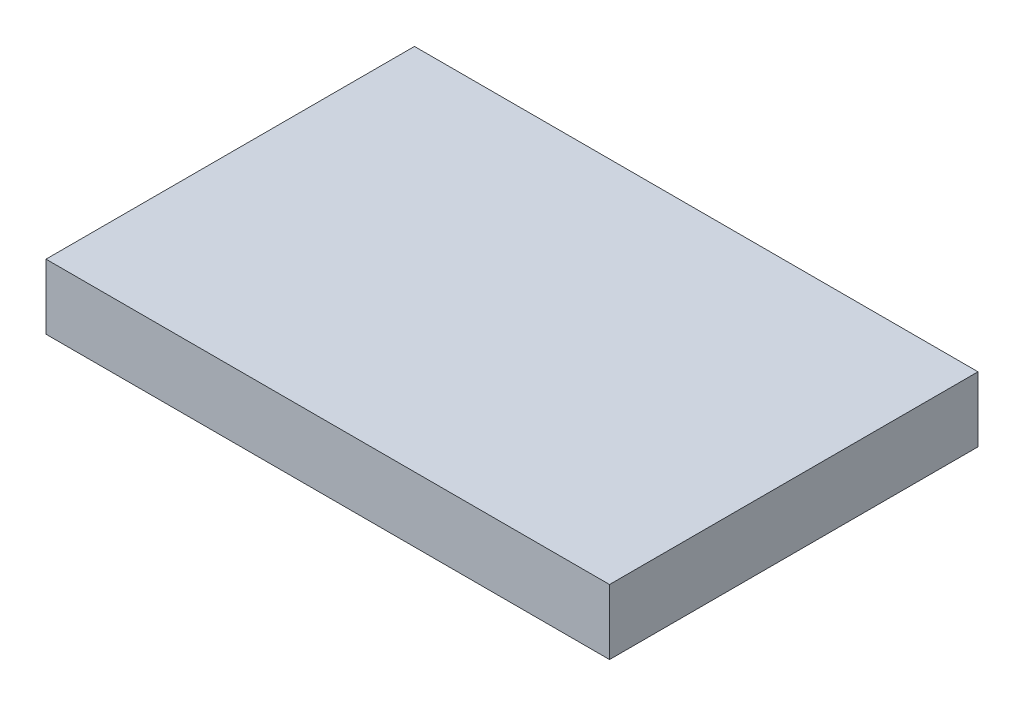
ISO-10303-21;
HEADER;
FILE_DESCRIPTION(('STEP AP214'),'2;1');
FILE_NAME('part.step','',(''),(''),'','','');
FILE_SCHEMA(('AUTOMOTIVE_DESIGN { 1 0 10303 214 1 1 1 1 }'));
ENDSEC;
DATA;
#1=APPLICATION_CONTEXT('core data for automotive mechanical design processes');
#2=APPLICATION_PROTOCOL_DEFINITION('international standard','automotive_design',2000,#1);
#3=PRODUCT_CONTEXT('',#1,'mechanical');
#4=PRODUCT('Part','Part','',(#3));
#5=PRODUCT_RELATED_PRODUCT_CATEGORY('part','',(#4));
#6=PRODUCT_DEFINITION_FORMATION('','',#4);
#7=PRODUCT_DEFINITION_CONTEXT('part definition',#1,'design');
#8=PRODUCT_DEFINITION('design','',#6,#7);
#9=PRODUCT_DEFINITION_SHAPE('','',#8);
#10=(LENGTH_UNIT() NAMED_UNIT(*) SI_UNIT(.MILLI.,.METRE.));
#11=(NAMED_UNIT(*) PLANE_ANGLE_UNIT() SI_UNIT($,.RADIAN.));
#12=(NAMED_UNIT(*) SI_UNIT($,.STERADIAN.) SOLID_ANGLE_UNIT());
#13=UNCERTAINTY_MEASURE_WITH_UNIT(LENGTH_MEASURE(1.E-05),#10,'distance_accuracy_value','');
#14=(GEOMETRIC_REPRESENTATION_CONTEXT(3) GLOBAL_UNCERTAINTY_ASSIGNED_CONTEXT((#13)) GLOBAL_UNIT_ASSIGNED_CONTEXT((#10,
#11,#12)) REPRESENTATION_CONTEXT('',''));
#15=CARTESIAN_POINT('',(0.,0.,0.));
#16=DIRECTION('',(0.,0.,1.));
#17=DIRECTION('',(1.,0.,0.));
#18=AXIS2_PLACEMENT_3D('',#15,#16,#17);
#19=CARTESIAN_POINT('',(-33.3639583333333,9.525,-21.8413541666667));
#20=DIRECTION('',(1.,0.,0.));
#21=DIRECTION('',(0.,0.,-1.));
#22=AXIS2_PLACEMENT_3D('',#19,#20,#21);
#23=PLANE('',#22);
#24=DIRECTION('',(0.,0.,1.));
#25=VECTOR('',#24,1.);
#26=CARTESIAN_POINT('',(-33.3639583333333,0.,-21.8413541666667));
#27=LINE('',#26,#25);
#28=CARTESIAN_POINT('',(-33.3639583333333,0.,-21.8413541666667));
#29=VERTEX_POINT('',#28);
#30=CARTESIAN_POINT('',(-33.3639583333333,0.,32.1336458333333));
#31=VERTEX_POINT('',#30);
#32=EDGE_CURVE('E96',#29,#31,#27,.T.);
#33=ORIENTED_EDGE('',*,*,#32,.T.);
#34=DIRECTION('',(0.,-1.,0.));
#35=VECTOR('',#34,1.);
#36=CARTESIAN_POINT('',(-33.3639583333333,9.525,32.1336458333333));
#37=LINE('',#36,#35);
#38=CARTESIAN_POINT('',(-33.3639583333333,9.525,32.1336458333333));
#39=VERTEX_POINT('',#38);
#40=EDGE_CURVE('E11',#39,#31,#37,.T.);
#41=ORIENTED_EDGE('',*,*,#40,.F.);
#42=DIRECTION('',(0.,0.,1.));
#43=VECTOR('',#42,1.);
#44=CARTESIAN_POINT('',(-33.3639583333333,9.525,-21.8413541666667));
#45=LINE('',#44,#43);
#46=CARTESIAN_POINT('',(-33.3639583333333,9.525,-21.8413541666667));
#47=VERTEX_POINT('',#46);
#48=EDGE_CURVE('E84',#47,#39,#45,.T.);
#49=ORIENTED_EDGE('',*,*,#48,.F.);
#50=DIRECTION('',(0.,-1.,0.));
#51=VECTOR('',#50,1.);
#52=CARTESIAN_POINT('',(-33.3639583333333,9.525,-21.8413541666667));
#53=LINE('',#52,#51);
#54=EDGE_CURVE('E92',#47,#29,#53,.T.);
#55=ORIENTED_EDGE('',*,*,#54,.T.);
#56=EDGE_LOOP('',(#33,#41,#49,#55));
#57=FACE_BOUND('',#56,.T.);
#58=ADVANCED_FACE('F33',(#57),#23,.F.);
#59=CARTESIAN_POINT('',(-33.3639583333333,9.525,32.1336458333333));
#60=DIRECTION('',(0.,0.,-1.));
#61=DIRECTION('',(-1.,0.,0.));
#62=AXIS2_PLACEMENT_3D('',#59,#60,#61);
#63=PLANE('',#62);
#64=DIRECTION('',(1.,0.,0.));
#65=VECTOR('',#64,1.);
#66=CARTESIAN_POINT('',(-33.3639583333333,0.,32.1336458333333));
#67=LINE('',#66,#65);
#68=CARTESIAN_POINT('',(49.1860416666667,0.,32.1336458333333));
#69=VERTEX_POINT('',#68);
#70=EDGE_CURVE('E88',#31,#69,#67,.T.);
#71=ORIENTED_EDGE('',*,*,#70,.T.);
#72=DIRECTION('',(0.,-1.,0.));
#73=VECTOR('',#72,1.);
#74=CARTESIAN_POINT('',(49.1860416666667,9.525,32.1336458333333));
#75=LINE('',#74,#73);
#76=CARTESIAN_POINT('',(49.1860416666667,9.525,32.1336458333333));
#77=VERTEX_POINT('',#76);
#78=EDGE_CURVE('E41',#77,#69,#75,.T.);
#79=ORIENTED_EDGE('',*,*,#78,.F.);
#80=DIRECTION('',(1.,0.,0.));
#81=VECTOR('',#80,1.);
#82=CARTESIAN_POINT('',(-33.3639583333333,9.525,32.1336458333333));
#83=LINE('',#82,#81);
#84=EDGE_CURVE('E79',#39,#77,#83,.T.);
#85=ORIENTED_EDGE('',*,*,#84,.F.);
#86=ORIENTED_EDGE('',*,*,#40,.T.);
#87=EDGE_LOOP('',(#71,#79,#85,#86));
#88=FACE_BOUND('',#87,.T.);
#89=ADVANCED_FACE('F87',(#88),#63,.F.);
#90=CARTESIAN_POINT('',(49.1860416666667,9.525,-21.8413541666667));
#91=DIRECTION('',(-1.,0.,0.));
#92=DIRECTION('',(0.,0.,1.));
#93=AXIS2_PLACEMENT_3D('',#90,#91,#92);
#94=PLANE('',#93);
#95=DIRECTION('',(0.,0.,-1.));
#96=VECTOR('',#95,1.);
#97=CARTESIAN_POINT('',(49.1860416666667,0.,-21.8413541666667));
#98=LINE('',#97,#96);
#99=CARTESIAN_POINT('',(49.1860416666667,0.,-21.8413541666667));
#100=VERTEX_POINT('',#99);
#101=EDGE_CURVE('E66',#69,#100,#98,.T.);
#102=ORIENTED_EDGE('',*,*,#101,.T.);
#103=DIRECTION('',(0.,-1.,0.));
#104=VECTOR('',#103,1.);
#105=CARTESIAN_POINT('',(49.1860416666667,9.525,-21.8413541666667));
#106=LINE('',#105,#104);
#107=CARTESIAN_POINT('',(49.1860416666667,9.525,-21.8413541666667));
#108=VERTEX_POINT('',#107);
#109=EDGE_CURVE('E89',#108,#100,#106,.T.);
#110=ORIENTED_EDGE('',*,*,#109,.F.);
#111=DIRECTION('',(0.,0.,-1.));
#112=VECTOR('',#111,1.);
#113=CARTESIAN_POINT('',(49.1860416666667,9.525,-21.8413541666667));
#114=LINE('',#113,#112);
#115=EDGE_CURVE('E82',#77,#108,#114,.T.);
#116=ORIENTED_EDGE('',*,*,#115,.F.);
#117=ORIENTED_EDGE('',*,*,#78,.T.);
#118=EDGE_LOOP('',(#102,#110,#116,#117));
#119=FACE_BOUND('',#118,.T.);
#120=ADVANCED_FACE('F90',(#119),#94,.F.);
#121=CARTESIAN_POINT('',(-33.3639583333333,9.525,-21.8413541666667));
#122=DIRECTION('',(0.,0.,1.));
#123=DIRECTION('',(1.,0.,0.));
#124=AXIS2_PLACEMENT_3D('',#121,#122,#123);
#125=PLANE('',#124);
#126=DIRECTION('',(-1.,0.,0.));
#127=VECTOR('',#126,1.);
#128=CARTESIAN_POINT('',(-33.3639583333333,0.,-21.8413541666667));
#129=LINE('',#128,#127);
#130=EDGE_CURVE('E72',#100,#29,#129,.T.);
#131=ORIENTED_EDGE('',*,*,#130,.T.);
#132=ORIENTED_EDGE('',*,*,#54,.F.);
#133=DIRECTION('',(-1.,0.,0.));
#134=VECTOR('',#133,1.);
#135=CARTESIAN_POINT('',(-33.3639583333333,9.525,-21.8413541666667));
#136=LINE('',#135,#134);
#137=EDGE_CURVE('E49',#108,#47,#136,.T.);
#138=ORIENTED_EDGE('',*,*,#137,.F.);
#139=ORIENTED_EDGE('',*,*,#109,.T.);
#140=EDGE_LOOP('',(#131,#132,#138,#139));
#141=FACE_BOUND('',#140,.T.);
#142=ADVANCED_FACE('F103',(#141),#125,.F.);
#143=CARTESIAN_POINT('',(0.,9.525,0.));
#144=DIRECTION('',(0.,1.,0.));
#145=DIRECTION('',(0.,0.,1.));
#146=AXIS2_PLACEMENT_3D('',#143,#144,#145);
#147=PLANE('',#146);
#148=ORIENTED_EDGE('',*,*,#48,.T.);
#149=ORIENTED_EDGE('',*,*,#84,.T.);
#150=ORIENTED_EDGE('',*,*,#115,.T.);
#151=ORIENTED_EDGE('',*,*,#137,.T.);
#152=EDGE_LOOP('',(#148,#149,#150,#151));
#153=FACE_BOUND('',#152,.T.);
#154=ADVANCED_FACE('F80',(#153),#147,.T.);
#155=CARTESIAN_POINT('',(0.,0.,0.));
#156=DIRECTION('',(0.,1.,0.));
#157=DIRECTION('',(0.,0.,1.));
#158=AXIS2_PLACEMENT_3D('',#155,#156,#157);
#159=PLANE('',#158);
#160=ORIENTED_EDGE('',*,*,#32,.F.);
#161=ORIENTED_EDGE('',*,*,#130,.F.);
#162=ORIENTED_EDGE('',*,*,#101,.F.);
#163=ORIENTED_EDGE('',*,*,#70,.F.);
#164=EDGE_LOOP('',(#160,#161,#162,#163));
#165=FACE_BOUND('',#164,.T.);
#166=ADVANCED_FACE('F106',(#165),#159,.F.);
#167=CLOSED_SHELL('',(#58,#89,#120,#142,#154,#166));
#168=MANIFOLD_SOLID_BREP('B2',#167);
#169=ADVANCED_BREP_SHAPE_REPRESENTATION('',(#18,#168),#14);
#170=SHAPE_DEFINITION_REPRESENTATION(#9,#169);
ENDSEC;
END-ISO-10303-21;
